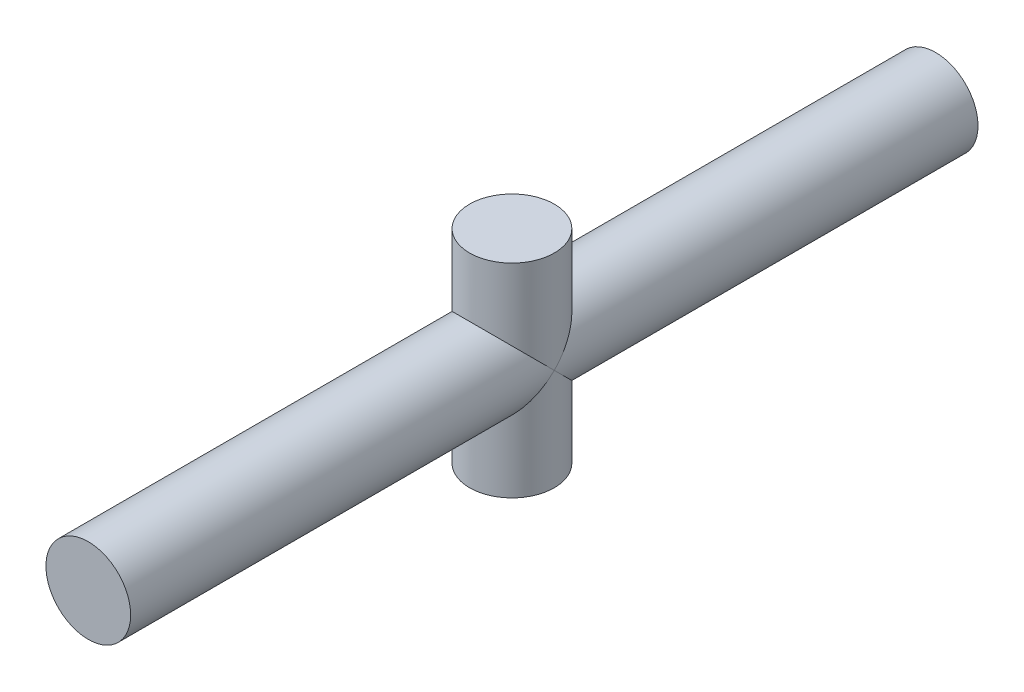
ISO-10303-21;
HEADER;
FILE_DESCRIPTION(('STEP AP214'),'2;1');
FILE_NAME('part.step','',(''),(''),'','','');
FILE_SCHEMA(('AUTOMOTIVE_DESIGN { 1 0 10303 214 1 1 1 1 }'));
ENDSEC;
DATA;
#1=APPLICATION_CONTEXT('core data for automotive mechanical design processes');
#2=APPLICATION_PROTOCOL_DEFINITION('international standard','automotive_design',2000,#1);
#3=PRODUCT_CONTEXT('',#1,'mechanical');
#4=PRODUCT('Part','Part','',(#3));
#5=PRODUCT_RELATED_PRODUCT_CATEGORY('part','',(#4));
#6=PRODUCT_DEFINITION_FORMATION('','',#4);
#7=PRODUCT_DEFINITION_CONTEXT('part definition',#1,'design');
#8=PRODUCT_DEFINITION('design','',#6,#7);
#9=PRODUCT_DEFINITION_SHAPE('','',#8);
#10=(LENGTH_UNIT() NAMED_UNIT(*) SI_UNIT(.MILLI.,.METRE.));
#11=(NAMED_UNIT(*) PLANE_ANGLE_UNIT() SI_UNIT($,.RADIAN.));
#12=(NAMED_UNIT(*) SI_UNIT($,.STERADIAN.) SOLID_ANGLE_UNIT());
#13=UNCERTAINTY_MEASURE_WITH_UNIT(LENGTH_MEASURE(1.E-05),#10,'distance_accuracy_value','');
#14=(GEOMETRIC_REPRESENTATION_CONTEXT(3) GLOBAL_UNCERTAINTY_ASSIGNED_CONTEXT((#13)) GLOBAL_UNIT_ASSIGNED_CONTEXT((#10,
#11,#12)) REPRESENTATION_CONTEXT('',''));
#15=CARTESIAN_POINT('',(0.,0.,0.));
#16=DIRECTION('',(0.,0.,1.));
#17=DIRECTION('',(1.,0.,0.));
#18=AXIS2_PLACEMENT_3D('',#15,#16,#17);
#19=CARTESIAN_POINT('',(0.,12.,0.));
#20=DIRECTION('',(0.,-1.,0.));
#21=DIRECTION('',(0.,0.,-1.));
#22=AXIS2_PLACEMENT_3D('',#19,#20,#21);
#23=CYLINDRICAL_SURFACE('',#22,2.5);
#24=CARTESIAN_POINT('',(0.,12.,0.));
#25=DIRECTION('',(0.,1.,0.));
#26=DIRECTION('',(0.,0.,1.));
#27=AXIS2_PLACEMENT_3D('',#24,#25,#26);
#28=CIRCLE('',#27,2.5);
#29=CARTESIAN_POINT('',(0.,12.,2.5));
#30=VERTEX_POINT('',#29);
#31=EDGE_CURVE('E72',#30,#30,#28,.T.);
#32=ORIENTED_EDGE('',*,*,#31,.F.);
#33=EDGE_LOOP('',(#32));
#34=FACE_BOUND('',#33,.T.);
#35=CARTESIAN_POINT('',(0.,6.,0.));
#36=DIRECTION('',(0.,-0.707106781186547,-0.707106781186547));
#37=DIRECTION('',(0.,-0.707106781186547,0.707106781186547));
#38=AXIS2_PLACEMENT_3D('',#35,#36,#37);
#39=ELLIPSE('',#38,3.53553390593274,2.5);
#40=CARTESIAN_POINT('',(-2.5,6.,0.));
#41=VERTEX_POINT('',#40);
#42=CARTESIAN_POINT('',(2.5,6.,0.));
#43=VERTEX_POINT('',#42);
#44=EDGE_CURVE('E54',#41,#43,#39,.T.);
#45=ORIENTED_EDGE('',*,*,#44,.F.);
#46=CARTESIAN_POINT('',(0.,6.,0.));
#47=DIRECTION('',(0.,-0.707106781186547,0.707106781186547));
#48=DIRECTION('',(0.,-0.707106781186547,-0.707106781186547));
#49=AXIS2_PLACEMENT_3D('',#46,#47,#48);
#50=ELLIPSE('',#49,3.53553390593274,2.5);
#51=EDGE_CURVE('E66',#43,#41,#50,.T.);
#52=ORIENTED_EDGE('',*,*,#51,.F.);
#53=EDGE_LOOP('',(#45,#52));
#54=FACE_BOUND('',#53,.T.);
#55=ADVANCED_FACE('F45',(#34,#54),#23,.T.);
#56=CARTESIAN_POINT('',(0.,12.,0.));
#57=DIRECTION('',(0.,1.,0.));
#58=DIRECTION('',(0.,0.,1.));
#59=AXIS2_PLACEMENT_3D('',#56,#57,#58);
#60=PLANE('',#59);
#61=ORIENTED_EDGE('',*,*,#31,.T.);
#62=EDGE_LOOP('',(#61));
#63=FACE_BOUND('',#62,.T.);
#64=ADVANCED_FACE('F96',(#63),#60,.T.);
#65=CARTESIAN_POINT('',(0.,6.,-25.));
#66=DIRECTION('',(0.,0.,1.));
#67=DIRECTION('',(1.,0.,0.));
#68=AXIS2_PLACEMENT_3D('',#65,#66,#67);
#69=PLANE('',#68);
#70=CARTESIAN_POINT('',(0.,6.,-25.));
#71=DIRECTION('',(0.,0.,1.));
#72=DIRECTION('',(1.,0.,0.));
#73=AXIS2_PLACEMENT_3D('',#70,#71,#72);
#74=CIRCLE('',#73,2.5);
#75=CARTESIAN_POINT('',(2.5,6.,-25.));
#76=VERTEX_POINT('',#75);
#77=EDGE_CURVE('E114',#76,#76,#74,.T.);
#78=ORIENTED_EDGE('',*,*,#77,.F.);
#79=EDGE_LOOP('',(#78));
#80=FACE_BOUND('',#79,.T.);
#81=ADVANCED_FACE('F93',(#80),#69,.F.);
#82=CARTESIAN_POINT('',(0.,6.,25.));
#83=DIRECTION('',(0.,0.,-1.));
#84=DIRECTION('',(-1.,0.,0.));
#85=AXIS2_PLACEMENT_3D('',#82,#83,#84);
#86=CYLINDRICAL_SURFACE('',#85,2.5);
#87=ORIENTED_EDGE('',*,*,#77,.T.);
#88=EDGE_LOOP('',(#87));
#89=FACE_BOUND('',#88,.T.);
#90=CARTESIAN_POINT('',(0.,6.,0.));
#91=DIRECTION('',(0.,-0.707106781186547,0.707106781186547));
#92=DIRECTION('',(0.,-0.707106781186547,-0.707106781186547));
#93=AXIS2_PLACEMENT_3D('',#90,#91,#92);
#94=ELLIPSE('',#93,3.53553390593274,2.5);
#95=EDGE_CURVE('E60',#43,#41,#94,.F.);
#96=ORIENTED_EDGE('',*,*,#95,.T.);
#97=ORIENTED_EDGE('',*,*,#44,.T.);
#98=EDGE_LOOP('',(#96,#97));
#99=FACE_BOUND('',#98,.T.);
#100=ADVANCED_FACE('F74',(#89,#99),#86,.T.);
#101=CARTESIAN_POINT('',(0.,0.,0.));
#102=DIRECTION('',(0.,1.,0.));
#103=DIRECTION('',(0.,0.,1.));
#104=AXIS2_PLACEMENT_3D('',#101,#102,#103);
#105=PLANE('',#104);
#106=CARTESIAN_POINT('',(0.,0.,0.));
#107=DIRECTION('',(0.,1.,0.));
#108=DIRECTION('',(0.,0.,1.));
#109=AXIS2_PLACEMENT_3D('',#106,#107,#108);
#110=CIRCLE('',#109,2.5);
#111=CARTESIAN_POINT('',(0.,0.,2.5));
#112=VERTEX_POINT('',#111);
#113=EDGE_CURVE('E107',#112,#112,#110,.T.);
#114=ORIENTED_EDGE('',*,*,#113,.F.);
#115=EDGE_LOOP('',(#114));
#116=FACE_BOUND('',#115,.T.);
#117=ADVANCED_FACE('F87',(#116),#105,.F.);
#118=ORIENTED_EDGE('',*,*,#113,.T.);
#119=EDGE_LOOP('',(#118));
#120=FACE_BOUND('',#119,.T.);
#121=CARTESIAN_POINT('',(0.,6.,0.));
#122=DIRECTION('',(0.,-0.707106781186547,-0.707106781186547));
#123=DIRECTION('',(0.,-0.707106781186547,0.707106781186547));
#124=AXIS2_PLACEMENT_3D('',#121,#122,#123);
#125=ELLIPSE('',#124,3.53553390593274,2.5);
#126=EDGE_CURVE('E11',#41,#43,#125,.F.);
#127=ORIENTED_EDGE('',*,*,#126,.F.);
#128=ORIENTED_EDGE('',*,*,#95,.F.);
#129=EDGE_LOOP('',(#127,#128));
#130=FACE_BOUND('',#129,.T.);
#131=ADVANCED_FACE('F47',(#120,#130),#23,.T.);
#132=CARTESIAN_POINT('',(0.,6.,25.));
#133=DIRECTION('',(0.,0.,1.));
#134=DIRECTION('',(1.,0.,0.));
#135=AXIS2_PLACEMENT_3D('',#132,#133,#134);
#136=CIRCLE('',#135,2.5);
#137=CARTESIAN_POINT('',(2.5,6.,25.));
#138=VERTEX_POINT('',#137);
#139=EDGE_CURVE('E111',#138,#138,#136,.T.);
#140=ORIENTED_EDGE('',*,*,#139,.F.);
#141=EDGE_LOOP('',(#140));
#142=FACE_BOUND('',#141,.T.);
#143=ORIENTED_EDGE('',*,*,#51,.T.);
#144=ORIENTED_EDGE('',*,*,#126,.T.);
#145=EDGE_LOOP('',(#143,#144));
#146=FACE_BOUND('',#145,.T.);
#147=ADVANCED_FACE('F76',(#142,#146),#86,.T.);
#148=CARTESIAN_POINT('',(0.,6.,25.));
#149=DIRECTION('',(0.,0.,1.));
#150=DIRECTION('',(1.,0.,0.));
#151=AXIS2_PLACEMENT_3D('',#148,#149,#150);
#152=PLANE('',#151);
#153=ORIENTED_EDGE('',*,*,#139,.T.);
#154=EDGE_LOOP('',(#153));
#155=FACE_BOUND('',#154,.T.);
#156=ADVANCED_FACE('F78',(#155),#152,.T.);
#157=CLOSED_SHELL('',(#55,#64,#81,#100,#117,#131,#147,#156));
#158=MANIFOLD_SOLID_BREP('B2',#157);
#159=ADVANCED_BREP_SHAPE_REPRESENTATION('',(#18,#158),#14);
#160=SHAPE_DEFINITION_REPRESENTATION(#9,#159);
ENDSEC;
END-ISO-10303-21;
